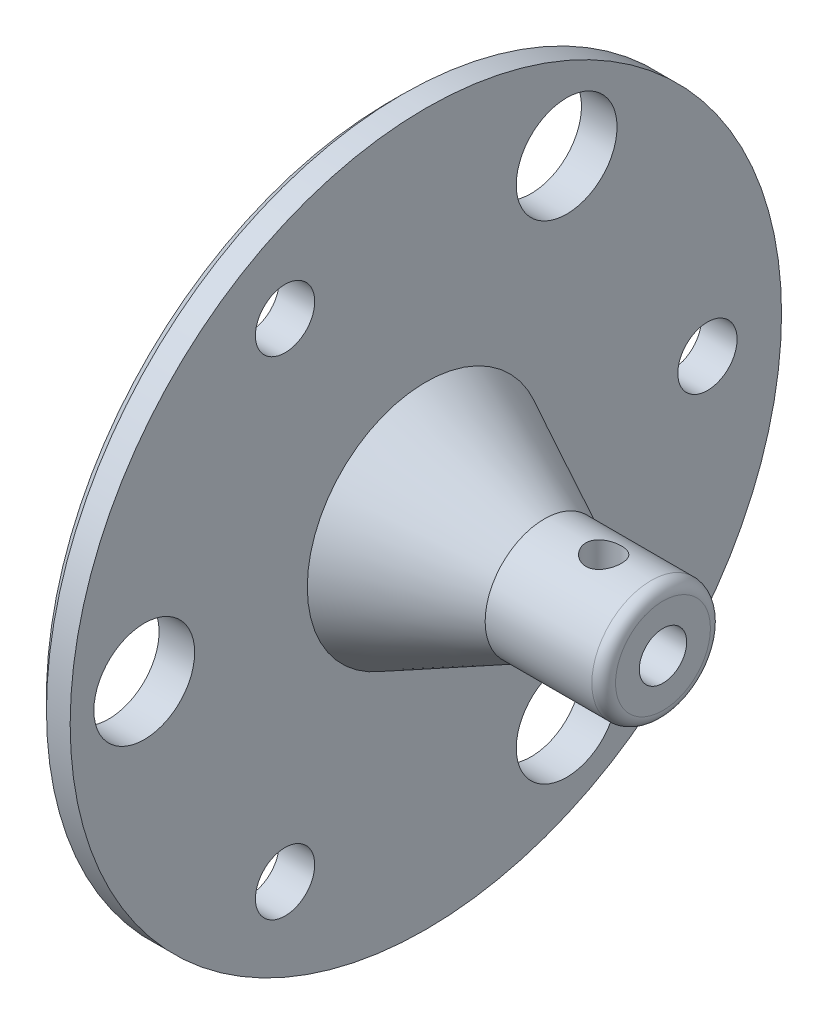
ISO-10303-21;
HEADER;
FILE_DESCRIPTION(('STEP AP214'),'2;1');
FILE_NAME('part.step','',(''),(''),'','','');
FILE_SCHEMA(('AUTOMOTIVE_DESIGN { 1 0 10303 214 1 1 1 1 }'));
ENDSEC;
DATA;
#1=APPLICATION_CONTEXT('core data for automotive mechanical design processes');
#2=APPLICATION_PROTOCOL_DEFINITION('international standard','automotive_design',2000,#1);
#3=PRODUCT_CONTEXT('',#1,'mechanical');
#4=PRODUCT('Part','Part','',(#3));
#5=PRODUCT_RELATED_PRODUCT_CATEGORY('part','',(#4));
#6=PRODUCT_DEFINITION_FORMATION('','',#4);
#7=PRODUCT_DEFINITION_CONTEXT('part definition',#1,'design');
#8=PRODUCT_DEFINITION('design','',#6,#7);
#9=PRODUCT_DEFINITION_SHAPE('','',#8);
#10=(LENGTH_UNIT() NAMED_UNIT(*) SI_UNIT(.MILLI.,.METRE.));
#11=(NAMED_UNIT(*) PLANE_ANGLE_UNIT() SI_UNIT($,.RADIAN.));
#12=(NAMED_UNIT(*) SI_UNIT($,.STERADIAN.) SOLID_ANGLE_UNIT());
#13=UNCERTAINTY_MEASURE_WITH_UNIT(LENGTH_MEASURE(1.E-05),#10,'distance_accuracy_value','');
#14=(GEOMETRIC_REPRESENTATION_CONTEXT(3) GLOBAL_UNCERTAINTY_ASSIGNED_CONTEXT((#13)) GLOBAL_UNIT_ASSIGNED_CONTEXT((#10,
#11,#12)) REPRESENTATION_CONTEXT('',''));
#15=CARTESIAN_POINT('',(0.,0.,0.));
#16=DIRECTION('',(0.,0.,1.));
#17=DIRECTION('',(1.,0.,0.));
#18=AXIS2_PLACEMENT_3D('',#15,#16,#17);
#19=CARTESIAN_POINT('',(20.,0.,0.));
#20=DIRECTION('',(-1.,0.,0.));
#21=DIRECTION('',(0.,0.,1.));
#22=AXIS2_PLACEMENT_3D('',#19,#20,#21);
#23=CYLINDRICAL_SURFACE('',#22,5.);
#24=CARTESIAN_POINT('',(19.,0.,0.));
#25=DIRECTION('',(1.,0.,0.));
#26=DIRECTION('',(0.,0.,-1.));
#27=AXIS2_PLACEMENT_3D('',#24,#25,#26);
#28=CIRCLE('',#27,5.);
#29=CARTESIAN_POINT('',(19.,0.,-5.));
#30=VERTEX_POINT('',#29);
#31=EDGE_CURVE('E50',#30,#30,#28,.F.);
#32=ORIENTED_EDGE('',*,*,#31,.T.);
#33=EDGE_LOOP('',(#32));
#34=FACE_BOUND('',#33,.T.);
#35=CARTESIAN_POINT('',(10.,0.,0.));
#36=DIRECTION('',(-1.,0.,0.));
#37=DIRECTION('',(0.,0.,1.));
#38=AXIS2_PLACEMENT_3D('',#35,#36,#37);
#39=CIRCLE('',#38,5.);
#40=CARTESIAN_POINT('',(10.,0.,5.));
#41=VERTEX_POINT('',#40);
#42=EDGE_CURVE('E127',#41,#41,#39,.T.);
#43=ORIENTED_EDGE('',*,*,#42,.F.);
#44=EDGE_LOOP('',(#43));
#45=FACE_BOUND('',#44,.T.);
#46=CARTESIAN_POINT('',(15.,4.76969600708473,-1.5));
#47=CARTESIAN_POINT('',(14.9178054520576,4.7696968572698,-1.49999897633764));
#48=CARTESIAN_POINT('',(14.835600775856,4.77184390209069,-1.49322108167142));
#49=CARTESIAN_POINT('',(14.6735947504081,4.780165783029,-1.46635844446749));
#50=CARTESIAN_POINT('',(14.5937942134985,4.78634196493468,-1.44626925573578));
#51=CARTESIAN_POINT('',(14.4389652717283,4.80196102485633,-1.39352753269955));
#52=CARTESIAN_POINT('',(14.3639291703669,4.81139846703232,-1.36089589394243));
#53=CARTESIAN_POINT('',(14.2203780660047,4.83246932547567,-1.28406421917929));
#54=CARTESIAN_POINT('',(14.1518640413156,4.8441030704102,-1.23986245137053));
#55=CARTESIAN_POINT('',(14.0211336094226,4.86866862185766,-1.13964754141627));
#56=CARTESIAN_POINT('',(13.9591541020537,4.88162808311636,-1.08333207175807));
#57=CARTESIAN_POINT('',(13.8453620486775,4.90714861936757,-0.961136237579599));
#58=CARTESIAN_POINT('',(13.7935508095501,4.91970964297705,-0.895254645461111));
#59=CARTESIAN_POINT('',(13.7005373001667,4.94333214579389,-0.754111437793689));
#60=CARTESIAN_POINT('',(13.6595765755572,4.95435724342404,-0.678684021335814));
#61=CARTESIAN_POINT('',(13.5910127409572,4.97334435920684,-0.521624645369353));
#62=CARTESIAN_POINT('',(13.5634067501425,4.98130703789495,-0.439994028387911));
#63=CARTESIAN_POINT('',(13.5231199989095,4.99307646003589,-0.275323852630829));
#64=CARTESIAN_POINT('',(13.5100348723473,4.99699557369338,-0.1923913989538));
#65=CARTESIAN_POINT('',(13.4978826753536,5.00063201501348,-0.0254218237493145));
#66=CARTESIAN_POINT('',(13.498812660598,5.00035022521079,0.0586150620503687));
#67=CARTESIAN_POINT('',(13.514392868543,4.99569603817659,0.222571156600161));
#68=CARTESIAN_POINT('',(13.5286051938099,4.9914542020526,0.302536267641342));
#69=CARTESIAN_POINT('',(13.5696313359943,4.97951522112593,0.458889213442528));
#70=CARTESIAN_POINT('',(13.5964459509427,4.97181785750586,0.535276821322847));
#71=CARTESIAN_POINT('',(13.6622120234186,4.95365220986963,0.683347326351282));
#72=CARTESIAN_POINT('',(13.7013012028073,4.94315269676706,0.754965064694479));
#73=CARTESIAN_POINT('',(13.7903978524282,4.92049640648069,0.890764673783157));
#74=CARTESIAN_POINT('',(13.8404079129635,4.90833923637778,0.954944774872131));
#75=CARTESIAN_POINT('',(13.9521977507516,4.88311550488165,1.0766604815298));
#76=CARTESIAN_POINT('',(14.0143569190297,4.87003195321461,1.13384458040112));
#77=CARTESIAN_POINT('',(14.1475100178901,4.84483979887497,1.23707651539824));
#78=CARTESIAN_POINT('',(14.2185048253892,4.8327312931702,1.28312324482853));
#79=CARTESIAN_POINT('',(14.368239469249,4.81077903197678,1.3631399533545));
#80=CARTESIAN_POINT('',(14.4470470458629,4.80095810695957,1.39698989237679));
#81=CARTESIAN_POINT('',(14.6096072084455,4.78496392548436,1.45083362878413));
#82=CARTESIAN_POINT('',(14.6933581715346,4.7787894791583,1.4708319464056));
#83=CARTESIAN_POINT('',(14.8600823607393,4.77104849541241,1.49574770282165));
#84=CARTESIAN_POINT('',(14.942968223894,4.7693187867044,1.50119946380212));
#85=CARTESIAN_POINT('',(15.1084729000099,4.77021192441924,1.49835947233062));
#86=CARTESIAN_POINT('',(15.1910917487308,4.77283416156589,1.4900696437133));
#87=CARTESIAN_POINT('',(15.3514883779709,4.78197558554912,1.4604576357419));
#88=CARTESIAN_POINT('',(15.4293361642635,4.78839176507489,1.4394796143128));
#89=CARTESIAN_POINT('',(15.5804016908149,4.80429141231227,1.3854857774794));
#90=CARTESIAN_POINT('',(15.6536187141406,4.81377535359073,1.35246810342759));
#91=CARTESIAN_POINT('',(15.7955174640721,4.83505835023047,1.274318711965));
#92=CARTESIAN_POINT('',(15.8640247209858,4.84691271069799,1.22888564172729));
#93=CARTESIAN_POINT('',(15.9926381061808,4.87148205646987,1.12755301600385));
#94=CARTESIAN_POINT('',(16.0527422176128,4.88419724730003,1.07165095534897));
#95=CARTESIAN_POINT('',(16.1651804058147,4.90963633548158,0.948455132493599));
#96=CARTESIAN_POINT('',(16.217135628987,4.92234245063004,0.880811065857434));
#97=CARTESIAN_POINT('',(16.3089667010277,4.94584851748651,0.73746178459025));
#98=CARTESIAN_POINT('',(16.3488431497815,4.95664856384717,0.661756970543946));
#99=CARTESIAN_POINT('',(16.4150000305683,4.97505970474957,0.504935504705224));
#100=CARTESIAN_POINT('',(16.441382016159,4.98269453424966,0.42386462203784));
#101=CARTESIAN_POINT('',(16.4800609188904,4.99401979596827,0.258169966504589));
#102=CARTESIAN_POINT('',(16.4923618659484,4.9977113567088,0.173547217354763));
#103=CARTESIAN_POINT('',(16.5022230440545,5.00066544081399,0.00665215388274287));
#104=CARTESIAN_POINT('',(16.5003326954078,5.00009305111322,-0.0755851790862066));
#105=CARTESIAN_POINT('',(16.4831783675009,4.99497264465037,-0.238519481164404));
#106=CARTESIAN_POINT('',(16.4679151465196,4.99042485330463,-0.319216537346529));
#107=CARTESIAN_POINT('',(16.4247883386004,4.97791168358327,-0.475935813041359));
#108=CARTESIAN_POINT('',(16.397061819351,4.96998352900866,-0.551998927351393));
#109=CARTESIAN_POINT('',(16.3299180854928,4.9515294303945,-0.698433237752054));
#110=CARTESIAN_POINT('',(16.2904989497138,4.94100305949946,-0.768803496050581));
#111=CARTESIAN_POINT('',(16.19962654257,4.91803965828228,-0.904301892420564));
#112=CARTESIAN_POINT('',(16.1478285699992,4.90555226923559,-0.969190250076768));
#113=CARTESIAN_POINT('',(16.0342896116672,4.88023537212334,-1.08953757134595));
#114=CARTESIAN_POINT('',(15.9725457621018,4.86740576641079,-1.14499380960194));
#115=CARTESIAN_POINT('',(15.8386592216895,4.84240680631319,-1.24656269394549));
#116=CARTESIAN_POINT('',(15.7662614466096,4.83026852693485,-1.29234759757956));
#117=CARTESIAN_POINT('',(15.614444825839,4.80852547508793,-1.37104313528776));
#118=CARTESIAN_POINT('',(15.5350293763988,4.79891948596956,-1.40395995557289));
#119=CARTESIAN_POINT('',(15.3802595683937,4.78427816717595,-1.4530194253295));
#120=CARTESIAN_POINT('',(15.305391353069,4.7788615484052,-1.47058859011232));
#121=CARTESIAN_POINT('',(15.1536847775042,4.77157042597167,-1.49407818835144));
#122=CARTESIAN_POINT('',(15.0768468153548,4.7696952122143,-1.50000095706095));
#123=CARTESIAN_POINT('',(15.,4.76969600708473,-1.5));
#124=B_SPLINE_CURVE_WITH_KNOTS('',3,(#46,#47,#48,#49,#50,#51,#52,#53,#54,#55,#56,#57,#58,#59,
#60,#61,#62,#63,#64,#65,#66,#67,#68,#69,#70,#71,#72,#73,#74,#75,#76,#77,#78,#79,#80,#81,#82,#83,
#84,#85,#86,#87,#88,#89,#90,#91,#92,#93,#94,#95,#96,#97,#98,#99,#100,#101,#102,#103,#104,#105,
#106,#107,#108,#109,#110,#111,#112,#113,#114,#115,#116,#117,#118,#119,#120,#121,#122,#123),
.UNSPECIFIED.,.T.,.F.,(4,2,2,2,2,2,2,2,2,2,2,2,2,2,2,2,2,2,2,2,2,2,2,2,2,2,2,2,2,2,2,2,2,2,2,2,
2,2,4),(0.,0.246300165915542,0.492682641689001,0.738656414466195,0.984667025370102,
1.23773150007984,1.49082847871273,1.74915939273645,2.00743455587877,2.25832140149558,
2.5091555410144,2.7520012599088,2.99486235890376,3.24055209335676,3.48630016590831,
3.74152147023278,3.99676812491863,4.25446238246267,4.51207250628412,4.7600808079031,
5.00805439107388,5.24958594938817,5.49115481045788,5.73920731809389,5.98731925928923,
6.24479506100602,6.50225807324202,6.75775391814325,7.01317662321682,7.2587630391122,
7.50433553047755,7.74727096872219,7.99024634491378,8.24099627054489,8.49181852629891,
8.75011639669147,9.00828993963944,9.23861153857448,9.46888695033561),.UNSPECIFIED.);
#125=CARTESIAN_POINT('',(15.,4.76969600708473,-1.5));
#126=VERTEX_POINT('',#125);
#127=EDGE_CURVE('E65',#126,#126,#124,.T.);
#128=ORIENTED_EDGE('',*,*,#127,.F.);
#129=EDGE_LOOP('',(#128));
#130=FACE_BOUND('',#129,.T.);
#131=ADVANCED_FACE('F30',(#34,#45,#130),#23,.T.);
#132=CARTESIAN_POINT('',(-3.,0.,0.));
#133=DIRECTION('',(1.,0.,0.));
#134=DIRECTION('',(0.,0.,-1.));
#135=AXIS2_PLACEMENT_3D('',#132,#133,#134);
#136=CYLINDRICAL_SURFACE('',#135,2.);
#137=CARTESIAN_POINT('',(-2.,0.,0.));
#138=DIRECTION('',(1.,0.,0.));
#139=DIRECTION('',(0.,0.,-1.));
#140=AXIS2_PLACEMENT_3D('',#137,#138,#139);
#141=CIRCLE('',#140,2.);
#142=CARTESIAN_POINT('',(-2.,0.,-2.));
#143=VERTEX_POINT('',#142);
#144=EDGE_CURVE('E10',#143,#143,#141,.F.);
#145=ORIENTED_EDGE('',*,*,#144,.T.);
#146=EDGE_LOOP('',(#145));
#147=FACE_BOUND('',#146,.T.);
#148=CARTESIAN_POINT('',(20.,0.,0.));
#149=DIRECTION('',(1.,0.,0.));
#150=DIRECTION('',(0.,0.,-1.));
#151=AXIS2_PLACEMENT_3D('',#148,#149,#150);
#152=CIRCLE('',#151,2.);
#153=CARTESIAN_POINT('',(20.,0.,-2.));
#154=VERTEX_POINT('',#153);
#155=EDGE_CURVE('E131',#154,#154,#152,.T.);
#156=ORIENTED_EDGE('',*,*,#155,.T.);
#157=EDGE_LOOP('',(#156));
#158=FACE_BOUND('',#157,.T.);
#159=CARTESIAN_POINT('',(15.,1.32287565553229,-1.5));
#160=CARTESIAN_POINT('',(15.0699974234256,1.32289190044095,-1.49999219049447));
#161=CARTESIAN_POINT('',(15.1400458343119,1.32856366615417,-1.4950410907442));
#162=CARTESIAN_POINT('',(15.2773298562095,1.34990644032801,-1.47578333210409));
#163=CARTESIAN_POINT('',(15.3445564450195,1.3656072516867,-1.46144878565587));
#164=CARTESIAN_POINT('',(15.4735798467384,1.4037512791687,-1.42483838991846));
#165=CARTESIAN_POINT('',(15.5354387767625,1.42609848244814,-1.40267483444956));
#166=CARTESIAN_POINT('',(15.6543454544452,1.47486455031267,-1.35130655299363));
#167=CARTESIAN_POINT('',(15.7113937824692,1.50128292264932,-1.3221026780169));
#168=CARTESIAN_POINT('',(15.8321127963166,1.56177312961147,-1.25039909811054));
#169=CARTESIAN_POINT('',(15.8946679342265,1.59628904009787,-1.20639573950363));
#170=CARTESIAN_POINT('',(16.0125254662423,1.66521164096378,-1.10933596759308));
#171=CARTESIAN_POINT('',(16.0678169648203,1.69961809339876,-1.056266222828));
#172=CARTESIAN_POINT('',(16.1808587386555,1.77262582436251,-0.929610192252516));
#173=CARTESIAN_POINT('',(16.2368059667199,1.81064921229758,-0.854047289142166));
#174=CARTESIAN_POINT('',(16.3346222082828,1.87882809751632,-0.691189714821943));
#175=CARTESIAN_POINT('',(16.3765242974688,1.90900204180106,-0.60392329383617));
#176=CARTESIAN_POINT('',(16.4332076859029,1.95034258990248,-0.447869023983648));
#177=CARTESIAN_POINT('',(16.4523570959785,1.96449710921006,-0.381446049692539));
#178=CARTESIAN_POINT('',(16.4813901159967,1.98605635937555,-0.245552609316545));
#179=CARTESIAN_POINT('',(16.4912817761067,1.99346695432364,-0.176084845995172));
#180=CARTESIAN_POINT('',(16.5012217338625,2.00091375578087,-0.0358650926220302));
#181=CARTESIAN_POINT('',(16.5012444543764,2.00093080057495,0.0348897591186365));
#182=CARTESIAN_POINT('',(16.4913820632197,1.99354206503066,0.175316156674034));
#183=CARTESIAN_POINT('',(16.4814946570919,1.98613456571337,0.244987447822224));
#184=CARTESIAN_POINT('',(16.4529189494101,1.96491377944411,0.378889193792649));
#185=CARTESIAN_POINT('',(16.4345436736129,1.9513285776568,0.443224268236294));
#186=CARTESIAN_POINT('',(16.3900043578178,1.91882278657017,0.567680485046395));
#187=CARTESIAN_POINT('',(16.3638386194868,1.89990103394193,0.627800705033634));
#188=CARTESIAN_POINT('',(16.3014703848547,1.85561045984504,0.749216921864729));
#189=CARTESIAN_POINT('',(16.2644879033812,1.82976540608097,0.809935384713598));
#190=CARTESIAN_POINT('',(16.1832662960295,1.77460702483739,0.924567250548284));
#191=CARTESIAN_POINT('',(16.1390209863001,1.74529074780454,0.978474784621219));
#192=CARTESIAN_POINT('',(16.0347766511791,1.6789376587236,1.08908204283328));
#193=CARTESIAN_POINT('',(15.9733907899736,1.64151655866368,1.14424493004784));
#194=CARTESIAN_POINT('',(15.8421654163781,1.5672595828377,1.24400875556227));
#195=CARTESIAN_POINT('',(15.7723219004749,1.53042399363524,1.28860466211477));
#196=CARTESIAN_POINT('',(15.6390181297544,1.46819425999159,1.358732064116));
#197=CARTESIAN_POINT('',(15.5770129546994,1.44197599789983,1.38628866868102));
#198=CARTESIAN_POINT('',(15.4479347185806,1.39536741257394,1.43319397108784));
#199=CARTESIAN_POINT('',(15.3808735203096,1.37496395320511,1.45256121808259));
#200=CARTESIAN_POINT('',(15.2563130560017,1.34640050620232,1.47902385350669));
#201=CARTESIAN_POINT('',(15.1995529178831,1.3366153955687,1.48779069496582));
#202=CARTESIAN_POINT('',(15.0846445338262,1.32435588438334,1.49871760619789));
#203=CARTESIAN_POINT('',(15.0264981600972,1.32187213058307,1.50088612873265));
#204=CARTESIAN_POINT('',(14.9105210082666,1.32462868790497,1.49845270115552));
#205=CARTESIAN_POINT('',(14.8526903541903,1.32987184207164,1.4938482589949));
#206=CARTESIAN_POINT('',(14.7389238475571,1.34721218775046,1.4782252727197));
#207=CARTESIAN_POINT('',(14.6829914020519,1.35932107727345,1.46719578056394));
#208=CARTESIAN_POINT('',(14.5536619550611,1.39427758287802,1.43413959562387));
#209=CARTESIAN_POINT('',(14.481564046085,1.41944823697315,1.40954189769242));
#210=CARTESIAN_POINT('',(14.3436923363599,1.47537861079975,1.35088877838435));
#211=CARTESIAN_POINT('',(14.2779304827053,1.5061485847723,1.31681594335477));
#212=CARTESIAN_POINT('',(14.1506509919519,1.57108282375649,1.23869774116696));
#213=CARTESIAN_POINT('',(14.0893671237817,1.60532883846045,1.19434110060342));
#214=CARTESIAN_POINT('',(13.9739979036388,1.67347506272361,1.09682562914593));
#215=CARTESIAN_POINT('',(13.9199160720111,1.70737509574665,1.04366252194464));
#216=CARTESIAN_POINT('',(13.8087230083706,1.77960222623532,0.916234513829627));
#217=CARTESIAN_POINT('',(13.7535247611424,1.81728174165356,0.839896270946863));
#218=CARTESIAN_POINT('',(13.6573792665491,1.88453104769825,0.675551612651275));
#219=CARTESIAN_POINT('',(13.6164011754187,1.91411836052283,0.587571029974858));
#220=CARTESIAN_POINT('',(13.5615620085531,1.95419406402379,0.430755661496918));
#221=CARTESIAN_POINT('',(13.5432432067246,1.96775478029639,0.364250057327479));
#222=CARTESIAN_POINT('',(13.5158712036925,1.98810265589123,0.228364464964359));
#223=CARTESIAN_POINT('',(13.5068097184515,1.9948958710696,0.15898710456195));
#224=CARTESIAN_POINT('',(13.4984836090714,2.00113566717062,0.0191476059404057));
#225=CARTESIAN_POINT('',(13.4992419826518,2.00056500218907,-0.0513166925870805));
#226=CARTESIAN_POINT('',(13.5105609913012,1.9920880324381,-0.191009011030074));
#227=CARTESIAN_POINT('',(13.5211242377075,1.98417977344351,-0.260236696591283));
#228=CARTESIAN_POINT('',(13.5509749161672,1.96203400925195,-0.393521935254966));
#229=CARTESIAN_POINT('',(13.5700001813215,1.94798690792879,-0.457671236511436));
#230=CARTESIAN_POINT('',(13.6157880656189,1.91462720575136,-0.581661343097383));
#231=CARTESIAN_POINT('',(13.6425523398309,1.89531347862386,-0.641501223388809));
#232=CARTESIAN_POINT('',(13.706277937596,1.85017642210641,-0.762547698766807));
#233=CARTESIAN_POINT('',(13.7440509313596,1.82386352707581,-0.823141236713413));
#234=CARTESIAN_POINT('',(13.8268664405542,1.76785506075717,-0.93741481172421));
#235=CARTESIAN_POINT('',(13.871915637286,1.73815638795658,-0.991088412383369));
#236=CARTESIAN_POINT('',(13.9780053665608,1.67106353042107,-1.10112380660681));
#237=CARTESIAN_POINT('',(14.0404463994399,1.63330922504697,-1.15591691541995));
#238=CARTESIAN_POINT('',(14.1738680718999,1.55866082463333,-1.2547525342935));
#239=CARTESIAN_POINT('',(14.2448518260366,1.52176704921892,-1.29879110556728));
#240=CARTESIAN_POINT('',(14.3788832505903,1.46049601449285,-1.36695971301454));
#241=CARTESIAN_POINT('',(14.4403349827065,1.43513625007637,-1.39333526337998));
#242=CARTESIAN_POINT('',(14.5680829130559,1.39032564651233,-1.43805398028599));
#243=CARTESIAN_POINT('',(14.6343656915954,1.37085915899696,-1.45641847678344));
#244=CARTESIAN_POINT('',(14.7507882195969,1.34532423383262,-1.4799705775638));
#245=CARTESIAN_POINT('',(14.7999670712905,1.3370013026568,-1.48744249026867));
#246=CARTESIAN_POINT('',(14.8994223330337,1.32577295392455,-1.49745839072448));
#247=CARTESIAN_POINT('',(14.9496980009437,1.32286398151145,-1.50000561211714));
#248=CARTESIAN_POINT('',(15.,1.32287565553229,-1.5));
#249=B_SPLINE_CURVE_WITH_KNOTS('',3,(#159,#160,#161,#162,#163,#164,#165,#166,#167,#168,#169,
#170,#171,#172,#173,#174,#175,#176,#177,#178,#179,#180,#181,#182,#183,#184,#185,#186,#187,#188,
#189,#190,#191,#192,#193,#194,#195,#196,#197,#198,#199,#200,#201,#202,#203,#204,#205,#206,#207,
#208,#209,#210,#211,#212,#213,#214,#215,#216,#217,#218,#219,#220,#221,#222,#223,#224,#225,#226,
#227,#228,#229,#230,#231,#232,#233,#234,#235,#236,#237,#238,#239,#240,#241,#242,#243,#244,#245,
#246,#247,#248),.UNSPECIFIED.,.T.,.F.,(4,2,2,2,2,2,2,2,2,2,2,2,2,2,2,2,2,2,2,2,2,2,2,2,2,2,2,2,
2,2,2,2,2,2,2,2,2,2,2,2,2,2,2,2,4),(0.,0.20973177668449,0.420089722582993,0.627545385620139,
0.834975984672346,1.08585208691169,1.33710031031849,1.63964848103538,1.94147907444963,
2.15227725277555,2.36289195870711,2.57405250727806,2.78526195641288,2.9892375589505,
3.19325766108669,3.41936844116895,3.64567274887663,3.91649517204701,4.18744629647933,
4.40499409477196,4.62204646613006,4.79608005545901,4.96989060538193,5.14376512326213,
5.31793678696019,5.55730028202397,5.79710662639151,6.0454320909006,6.29387849446617,
6.59652499511462,6.89851088586565,7.10852896194426,7.3183589353918,7.52868041101043,
7.73905791773944,7.94332812691912,8.14764205379332,8.3751005248961,8.60276905744644,
8.87547580578154,9.1482822820853,9.36218279640835,9.57551025772699,9.72632812073766,
9.87704692032409),.UNSPECIFIED.);
#250=CARTESIAN_POINT('',(15.,1.32287565553229,-1.5));
#251=VERTEX_POINT('',#250);
#252=EDGE_CURVE('E57',#251,#251,#249,.T.);
#253=ORIENTED_EDGE('',*,*,#252,.F.);
#254=EDGE_LOOP('',(#253));
#255=FACE_BOUND('',#254,.T.);
#256=ADVANCED_FACE('F67',(#147,#158,#255),#136,.F.);
#257=CARTESIAN_POINT('',(-3.,0.,0.));
#258=DIRECTION('',(1.,0.,0.));
#259=DIRECTION('',(0.,0.,-1.));
#260=AXIS2_PLACEMENT_3D('',#257,#258,#259);
#261=CYLINDRICAL_SURFACE('',#260,30.);
#262=CARTESIAN_POINT('',(-1.99999999999999,0.,0.));
#263=DIRECTION('',(1.,0.,0.));
#264=DIRECTION('',(0.,0.,-1.));
#265=AXIS2_PLACEMENT_3D('',#262,#263,#264);
#266=CIRCLE('',#265,30.);
#267=CARTESIAN_POINT('',(-1.99999999999999,0.,-30.));
#268=VERTEX_POINT('',#267);
#269=EDGE_CURVE('E45',#268,#268,#266,.T.);
#270=ORIENTED_EDGE('',*,*,#269,.T.);
#271=EDGE_LOOP('',(#270));
#272=FACE_BOUND('',#271,.T.);
#273=CARTESIAN_POINT('',(0.,0.,0.));
#274=DIRECTION('',(1.,0.,0.));
#275=DIRECTION('',(0.,0.,-1.));
#276=AXIS2_PLACEMENT_3D('',#273,#274,#275);
#277=CIRCLE('',#276,30.);
#278=CARTESIAN_POINT('',(0.,0.,-30.));
#279=VERTEX_POINT('',#278);
#280=EDGE_CURVE('E56',#279,#279,#277,.T.);
#281=ORIENTED_EDGE('',*,*,#280,.F.);
#282=EDGE_LOOP('',(#281));
#283=FACE_BOUND('',#282,.T.);
#284=ADVANCED_FACE('F101',(#272,#283),#261,.T.);
#285=CARTESIAN_POINT('',(-3.,0.,0.));
#286=DIRECTION('',(1.,0.,0.));
#287=DIRECTION('',(0.,0.,-1.));
#288=AXIS2_PLACEMENT_3D('',#285,#286,#287);
#289=PLANE('',#288);
#290=CARTESIAN_POINT('',(-3.,0.,0.));
#291=DIRECTION('',(1.,0.,0.));
#292=DIRECTION('',(0.,0.,-1.));
#293=AXIS2_PLACEMENT_3D('',#290,#291,#292);
#294=CIRCLE('',#293,3.);
#295=CARTESIAN_POINT('',(-3.,0.,-3.));
#296=VERTEX_POINT('',#295);
#297=EDGE_CURVE('E37',#296,#296,#294,.T.);
#298=ORIENTED_EDGE('',*,*,#297,.T.);
#299=EDGE_LOOP('',(#298));
#300=FACE_BOUND('',#299,.T.);
#301=CARTESIAN_POINT('',(-3.,0.,0.));
#302=DIRECTION('',(1.,0.,0.));
#303=DIRECTION('',(0.,0.,-1.));
#304=AXIS2_PLACEMENT_3D('',#301,#302,#303);
#305=CIRCLE('',#304,29.);
#306=CARTESIAN_POINT('',(-3.,0.,-29.));
#307=VERTEX_POINT('',#306);
#308=EDGE_CURVE('E41',#307,#307,#305,.F.);
#309=ORIENTED_EDGE('',*,*,#308,.T.);
#310=EDGE_LOOP('',(#309));
#311=FACE_BOUND('',#310,.T.);
#312=CARTESIAN_POINT('',(-3.,-1.55201017997344E-12,-23.7499999999991));
#313=DIRECTION('',(-1.,0.,0.));
#314=DIRECTION('',(0.,0.,1.));
#315=AXIS2_PLACEMENT_3D('',#312,#313,#314);
#316=CIRCLE('',#315,2.50000000000185);
#317=CARTESIAN_POINT('',(-3.,-1.55201017997344E-12,-21.2499999999973));
#318=VERTEX_POINT('',#317);
#319=EDGE_CURVE('E144',#318,#318,#316,.T.);
#320=ORIENTED_EDGE('',*,*,#319,.F.);
#321=EDGE_LOOP('',(#320));
#322=FACE_BOUND('',#321,.T.);
#323=CARTESIAN_POINT('',(-3.,-20.5681033398804,11.8750000000018));
#324=DIRECTION('',(-1.,0.,0.));
#325=DIRECTION('',(0.,0.,1.));
#326=AXIS2_PLACEMENT_3D('',#323,#324,#325);
#327=CIRCLE('',#326,2.50000000000047);
#328=CARTESIAN_POINT('',(-3.,-20.5681033398804,14.3750000000022));
#329=VERTEX_POINT('',#328);
#330=EDGE_CURVE('E150',#329,#329,#327,.T.);
#331=ORIENTED_EDGE('',*,*,#330,.F.);
#332=EDGE_LOOP('',(#331));
#333=FACE_BOUND('',#332,.T.);
#334=CARTESIAN_POINT('',(-3.,-20.5681033398804,-11.8749999999983));
#335=DIRECTION('',(-1.,0.,0.));
#336=DIRECTION('',(0.,0.,1.));
#337=AXIS2_PLACEMENT_3D('',#334,#335,#336);
#338=CIRCLE('',#337,4.25000000000149);
#339=CARTESIAN_POINT('',(-3.,-20.5681033398804,-7.62499999999678));
#340=VERTEX_POINT('',#339);
#341=EDGE_CURVE('E156',#340,#340,#338,.T.);
#342=ORIENTED_EDGE('',*,*,#341,.F.);
#343=EDGE_LOOP('',(#342));
#344=FACE_BOUND('',#343,.T.);
#345=CARTESIAN_POINT('',(-3.,20.5681033398804,11.875));
#346=DIRECTION('',(-1.,0.,0.));
#347=DIRECTION('',(0.,0.,1.));
#348=AXIS2_PLACEMENT_3D('',#345,#346,#347);
#349=CIRCLE('',#348,2.5);
#350=CARTESIAN_POINT('',(-3.,20.5681033398804,14.375));
#351=VERTEX_POINT('',#350);
#352=EDGE_CURVE('E162',#351,#351,#349,.T.);
#353=ORIENTED_EDGE('',*,*,#352,.F.);
#354=EDGE_LOOP('',(#353));
#355=FACE_BOUND('',#354,.T.);
#356=CARTESIAN_POINT('',(-3.,1.48112667043109E-12,23.7500000000009));
#357=DIRECTION('',(-1.,0.,0.));
#358=DIRECTION('',(0.,0.,1.));
#359=AXIS2_PLACEMENT_3D('',#356,#357,#358);
#360=CIRCLE('',#359,4.25000000000175);
#361=CARTESIAN_POINT('',(-3.,1.48112667043109E-12,28.0000000000026));
#362=VERTEX_POINT('',#361);
#363=EDGE_CURVE('E89',#362,#362,#360,.T.);
#364=ORIENTED_EDGE('',*,*,#363,.F.);
#365=EDGE_LOOP('',(#364));
#366=FACE_BOUND('',#365,.T.);
#367=CARTESIAN_POINT('',(-3.,20.5681033398804,-11.875));
#368=DIRECTION('',(-1.,0.,0.));
#369=DIRECTION('',(0.,0.,1.));
#370=AXIS2_PLACEMENT_3D('',#367,#368,#369);
#371=CIRCLE('',#370,4.25);
#372=CARTESIAN_POINT('',(-3.,20.5681033398804,-7.625));
#373=VERTEX_POINT('',#372);
#374=EDGE_CURVE('E136',#373,#373,#371,.T.);
#375=ORIENTED_EDGE('',*,*,#374,.F.);
#376=EDGE_LOOP('',(#375));
#377=FACE_BOUND('',#376,.T.);
#378=ADVANCED_FACE('F97',(#300,#311,#322,#333,#344,#355,#366,#377),#289,.F.);
#379=CARTESIAN_POINT('',(0.,0.,0.));
#380=DIRECTION('',(1.,0.,0.));
#381=DIRECTION('',(0.,0.,-1.));
#382=AXIS2_PLACEMENT_3D('',#379,#380,#381);
#383=PLANE('',#382);
#384=CARTESIAN_POINT('',(0.,-1.55201017997344E-12,-23.7499999999991));
#385=DIRECTION('',(1.,0.,0.));
#386=DIRECTION('',(0.,0.,-1.));
#387=AXIS2_PLACEMENT_3D('',#384,#385,#386);
#388=CIRCLE('',#387,2.50000000000185);
#389=CARTESIAN_POINT('',(0.,-1.55201017997344E-12,-26.250000000001));
#390=VERTEX_POINT('',#389);
#391=EDGE_CURVE('E88',#390,#390,#388,.F.);
#392=ORIENTED_EDGE('',*,*,#391,.T.);
#393=EDGE_LOOP('',(#392));
#394=FACE_BOUND('',#393,.T.);
#395=CARTESIAN_POINT('',(0.,-20.5681033398804,11.8750000000018));
#396=DIRECTION('',(1.,0.,0.));
#397=DIRECTION('',(0.,0.,-1.));
#398=AXIS2_PLACEMENT_3D('',#395,#396,#397);
#399=CIRCLE('',#398,2.50000000000047);
#400=CARTESIAN_POINT('',(0.,-20.5681033398804,9.3750000000013));
#401=VERTEX_POINT('',#400);
#402=EDGE_CURVE('E147',#401,#401,#399,.F.);
#403=ORIENTED_EDGE('',*,*,#402,.T.);
#404=EDGE_LOOP('',(#403));
#405=FACE_BOUND('',#404,.T.);
#406=CARTESIAN_POINT('',(0.,-20.5681033398804,-11.8749999999983));
#407=DIRECTION('',(1.,0.,0.));
#408=DIRECTION('',(0.,0.,-1.));
#409=AXIS2_PLACEMENT_3D('',#406,#407,#408);
#410=CIRCLE('',#409,4.25000000000149);
#411=CARTESIAN_POINT('',(0.,-20.5681033398804,-16.1249999999998));
#412=VERTEX_POINT('',#411);
#413=EDGE_CURVE('E153',#412,#412,#410,.F.);
#414=ORIENTED_EDGE('',*,*,#413,.T.);
#415=EDGE_LOOP('',(#414));
#416=FACE_BOUND('',#415,.T.);
#417=CARTESIAN_POINT('',(0.,20.5681033398804,11.875));
#418=DIRECTION('',(1.,0.,0.));
#419=DIRECTION('',(0.,0.,-1.));
#420=AXIS2_PLACEMENT_3D('',#417,#418,#419);
#421=CIRCLE('',#420,2.5);
#422=CARTESIAN_POINT('',(0.,20.5681033398804,9.375));
#423=VERTEX_POINT('',#422);
#424=EDGE_CURVE('E159',#423,#423,#421,.F.);
#425=ORIENTED_EDGE('',*,*,#424,.T.);
#426=EDGE_LOOP('',(#425));
#427=FACE_BOUND('',#426,.T.);
#428=CARTESIAN_POINT('',(0.,1.48112667043109E-12,23.7500000000009));
#429=DIRECTION('',(1.,0.,0.));
#430=DIRECTION('',(0.,0.,-1.));
#431=AXIS2_PLACEMENT_3D('',#428,#429,#430);
#432=CIRCLE('',#431,4.25000000000175);
#433=CARTESIAN_POINT('',(0.,1.48112667043109E-12,19.4999999999991));
#434=VERTEX_POINT('',#433);
#435=EDGE_CURVE('E164',#434,#434,#432,.F.);
#436=ORIENTED_EDGE('',*,*,#435,.T.);
#437=EDGE_LOOP('',(#436));
#438=FACE_BOUND('',#437,.T.);
#439=CARTESIAN_POINT('',(0.,20.5681033398804,-11.875));
#440=DIRECTION('',(1.,0.,0.));
#441=DIRECTION('',(0.,0.,-1.));
#442=AXIS2_PLACEMENT_3D('',#439,#440,#441);
#443=CIRCLE('',#442,4.25);
#444=CARTESIAN_POINT('',(0.,20.5681033398804,-16.125));
#445=VERTEX_POINT('',#444);
#446=EDGE_CURVE('E137',#445,#445,#443,.F.);
#447=ORIENTED_EDGE('',*,*,#446,.T.);
#448=EDGE_LOOP('',(#447));
#449=FACE_BOUND('',#448,.T.);
#450=CARTESIAN_POINT('',(0.,0.,0.));
#451=DIRECTION('',(-1.,0.,0.));
#452=DIRECTION('',(0.,0.,1.));
#453=AXIS2_PLACEMENT_3D('',#450,#451,#452);
#454=CIRCLE('',#453,10.);
#455=CARTESIAN_POINT('',(0.,0.,10.));
#456=VERTEX_POINT('',#455);
#457=EDGE_CURVE('E125',#456,#456,#454,.T.);
#458=ORIENTED_EDGE('',*,*,#457,.T.);
#459=EDGE_LOOP('',(#458));
#460=FACE_BOUND('',#459,.T.);
#461=ORIENTED_EDGE('',*,*,#280,.T.);
#462=EDGE_LOOP('',(#461));
#463=FACE_BOUND('',#462,.T.);
#464=ADVANCED_FACE('F100',(#394,#405,#416,#427,#438,#449,#460,#463),#383,.T.);
#465=CARTESIAN_POINT('',(0.,0.,0.));
#466=DIRECTION('',(-1.,0.,0.));
#467=DIRECTION('',(0.,0.,1.));
#468=AXIS2_PLACEMENT_3D('',#465,#466,#467);
#469=CONICAL_SURFACE('',#468,10.,0.463647609000806);
#470=ORIENTED_EDGE('',*,*,#42,.T.);
#471=EDGE_LOOP('',(#470));
#472=FACE_BOUND('',#471,.T.);
#473=ORIENTED_EDGE('',*,*,#457,.F.);
#474=EDGE_LOOP('',(#473));
#475=FACE_BOUND('',#474,.T.);
#476=ADVANCED_FACE('F104',(#472,#475),#469,.T.);
#477=CARTESIAN_POINT('',(20.,0.,0.));
#478=DIRECTION('',(1.,0.,0.));
#479=DIRECTION('',(0.,0.,-1.));
#480=AXIS2_PLACEMENT_3D('',#477,#478,#479);
#481=PLANE('',#480);
#482=CARTESIAN_POINT('',(20.,0.,0.));
#483=DIRECTION('',(1.,0.,0.));
#484=DIRECTION('',(0.,0.,-1.));
#485=AXIS2_PLACEMENT_3D('',#482,#483,#484);
#486=CIRCLE('',#485,4.);
#487=CARTESIAN_POINT('',(20.,0.,-4.));
#488=VERTEX_POINT('',#487);
#489=EDGE_CURVE('E53',#488,#488,#486,.T.);
#490=ORIENTED_EDGE('',*,*,#489,.T.);
#491=EDGE_LOOP('',(#490));
#492=FACE_BOUND('',#491,.T.);
#493=ORIENTED_EDGE('',*,*,#155,.F.);
#494=EDGE_LOOP('',(#493));
#495=FACE_BOUND('',#494,.T.);
#496=ADVANCED_FACE('F96',(#492,#495),#481,.T.);
#497=CARTESIAN_POINT('',(20.001,20.5681033398804,-11.875));
#498=DIRECTION('',(-1.,0.,0.));
#499=DIRECTION('',(0.,0.,1.));
#500=AXIS2_PLACEMENT_3D('',#497,#498,#499);
#501=CYLINDRICAL_SURFACE('',#500,4.25);
#502=ORIENTED_EDGE('',*,*,#446,.F.);
#503=EDGE_LOOP('',(#502));
#504=FACE_BOUND('',#503,.T.);
#505=ORIENTED_EDGE('',*,*,#374,.T.);
#506=EDGE_LOOP('',(#505));
#507=FACE_BOUND('',#506,.T.);
#508=ADVANCED_FACE('F175',(#504,#507),#501,.F.);
#509=CARTESIAN_POINT('',(20.001,1.48112667043109E-12,23.7500000000009));
#510=DIRECTION('',(-1.,0.,0.));
#511=DIRECTION('',(0.,0.,1.));
#512=AXIS2_PLACEMENT_3D('',#509,#510,#511);
#513=CYLINDRICAL_SURFACE('',#512,4.25000000000175);
#514=ORIENTED_EDGE('',*,*,#435,.F.);
#515=EDGE_LOOP('',(#514));
#516=FACE_BOUND('',#515,.T.);
#517=ORIENTED_EDGE('',*,*,#363,.T.);
#518=EDGE_LOOP('',(#517));
#519=FACE_BOUND('',#518,.T.);
#520=ADVANCED_FACE('F78',(#516,#519),#513,.F.);
#521=CARTESIAN_POINT('',(20.001,20.5681033398804,11.875));
#522=DIRECTION('',(-1.,0.,0.));
#523=DIRECTION('',(0.,0.,1.));
#524=AXIS2_PLACEMENT_3D('',#521,#522,#523);
#525=CYLINDRICAL_SURFACE('',#524,2.5);
#526=ORIENTED_EDGE('',*,*,#424,.F.);
#527=EDGE_LOOP('',(#526));
#528=FACE_BOUND('',#527,.T.);
#529=ORIENTED_EDGE('',*,*,#352,.T.);
#530=EDGE_LOOP('',(#529));
#531=FACE_BOUND('',#530,.T.);
#532=ADVANCED_FACE('F182',(#528,#531),#525,.F.);
#533=CARTESIAN_POINT('',(20.001,-20.5681033398804,-11.8749999999983));
#534=DIRECTION('',(-1.,0.,0.));
#535=DIRECTION('',(0.,0.,1.));
#536=AXIS2_PLACEMENT_3D('',#533,#534,#535);
#537=CYLINDRICAL_SURFACE('',#536,4.25000000000149);
#538=ORIENTED_EDGE('',*,*,#413,.F.);
#539=EDGE_LOOP('',(#538));
#540=FACE_BOUND('',#539,.T.);
#541=ORIENTED_EDGE('',*,*,#341,.T.);
#542=EDGE_LOOP('',(#541));
#543=FACE_BOUND('',#542,.T.);
#544=ADVANCED_FACE('F193',(#540,#543),#537,.F.);
#545=CARTESIAN_POINT('',(20.001,-20.5681033398804,11.8750000000018));
#546=DIRECTION('',(-1.,0.,0.));
#547=DIRECTION('',(0.,0.,1.));
#548=AXIS2_PLACEMENT_3D('',#545,#546,#547);
#549=CYLINDRICAL_SURFACE('',#548,2.50000000000047);
#550=ORIENTED_EDGE('',*,*,#402,.F.);
#551=EDGE_LOOP('',(#550));
#552=FACE_BOUND('',#551,.T.);
#553=ORIENTED_EDGE('',*,*,#330,.T.);
#554=EDGE_LOOP('',(#553));
#555=FACE_BOUND('',#554,.T.);
#556=ADVANCED_FACE('F189',(#552,#555),#549,.F.);
#557=CARTESIAN_POINT('',(20.001,-1.55201017997344E-12,-23.7499999999991));
#558=DIRECTION('',(-1.,0.,0.));
#559=DIRECTION('',(0.,0.,1.));
#560=AXIS2_PLACEMENT_3D('',#557,#558,#559);
#561=CYLINDRICAL_SURFACE('',#560,2.50000000000185);
#562=ORIENTED_EDGE('',*,*,#391,.F.);
#563=EDGE_LOOP('',(#562));
#564=FACE_BOUND('',#563,.T.);
#565=ORIENTED_EDGE('',*,*,#319,.T.);
#566=EDGE_LOOP('',(#565));
#567=FACE_BOUND('',#566,.T.);
#568=ADVANCED_FACE('F76',(#564,#567),#561,.F.);
#569=CARTESIAN_POINT('',(15.,15.,0.));
#570=DIRECTION('',(0.,-1.,0.));
#571=DIRECTION('',(0.,0.,-1.));
#572=AXIS2_PLACEMENT_3D('',#569,#570,#571);
#573=CYLINDRICAL_SURFACE('',#572,1.5);
#574=ORIENTED_EDGE('',*,*,#252,.T.);
#575=EDGE_LOOP('',(#574));
#576=FACE_BOUND('',#575,.T.);
#577=ORIENTED_EDGE('',*,*,#127,.T.);
#578=EDGE_LOOP('',(#577));
#579=FACE_BOUND('',#578,.T.);
#580=ADVANCED_FACE('F71',(#576,#579),#573,.F.);
#581=CARTESIAN_POINT('',(19.,0.,0.));
#582=DIRECTION('',(1.,0.,0.));
#583=DIRECTION('',(0.,0.,-1.));
#584=AXIS2_PLACEMENT_3D('',#581,#582,#583);
#585=TOROIDAL_SURFACE('',#584,4.,1.);
#586=ORIENTED_EDGE('',*,*,#31,.F.);
#587=EDGE_LOOP('',(#586));
#588=FACE_BOUND('',#587,.T.);
#589=ORIENTED_EDGE('',*,*,#489,.F.);
#590=EDGE_LOOP('',(#589));
#591=FACE_BOUND('',#590,.T.);
#592=ADVANCED_FACE('F75',(#588,#591),#585,.T.);
#593=CARTESIAN_POINT('',(-1.99999999999999,0.,0.));
#594=DIRECTION('',(1.,0.,0.));
#595=DIRECTION('',(0.,0.,-1.));
#596=AXIS2_PLACEMENT_3D('',#593,#594,#595);
#597=CONICAL_SURFACE('',#596,30.,0.785398163397452);
#598=ORIENTED_EDGE('',*,*,#308,.F.);
#599=EDGE_LOOP('',(#598));
#600=FACE_BOUND('',#599,.T.);
#601=ORIENTED_EDGE('',*,*,#269,.F.);
#602=EDGE_LOOP('',(#601));
#603=FACE_BOUND('',#602,.T.);
#604=ADVANCED_FACE('F110',(#600,#603),#597,.T.);
#605=CARTESIAN_POINT('',(-3.,0.,0.));
#606=DIRECTION('',(-1.,0.,0.));
#607=DIRECTION('',(0.,0.,1.));
#608=AXIS2_PLACEMENT_3D('',#605,#606,#607);
#609=CONICAL_SURFACE('',#608,3.,0.785398163397448);
#610=ORIENTED_EDGE('',*,*,#144,.F.);
#611=EDGE_LOOP('',(#610));
#612=FACE_BOUND('',#611,.T.);
#613=ORIENTED_EDGE('',*,*,#297,.F.);
#614=EDGE_LOOP('',(#613));
#615=FACE_BOUND('',#614,.T.);
#616=ADVANCED_FACE('F32',(#612,#615),#609,.F.);
#617=CLOSED_SHELL('',(#131,#256,#284,#378,#464,#476,#496,#508,#520,#532,#544,#556,#568,#580,
#592,#604,#616));
#618=MANIFOLD_SOLID_BREP('B2',#617);
#619=ADVANCED_BREP_SHAPE_REPRESENTATION('',(#18,#618),#14);
#620=SHAPE_DEFINITION_REPRESENTATION(#9,#619);
ENDSEC;
END-ISO-10303-21;
